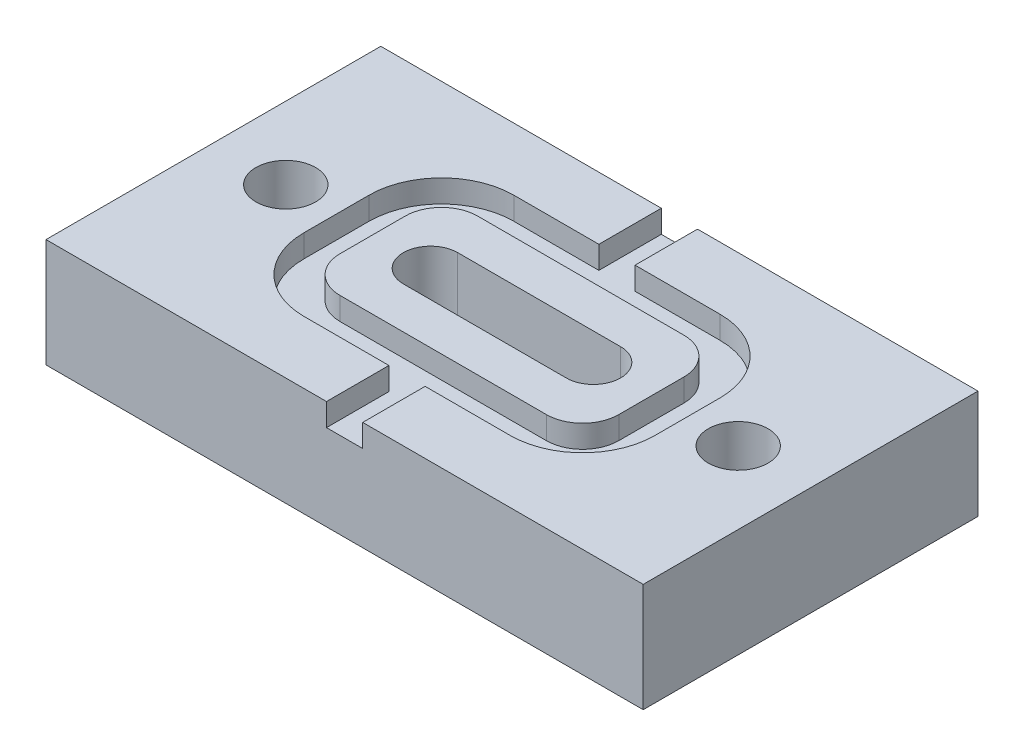
ISO-10303-21;
HEADER;
FILE_DESCRIPTION(('STEP AP214'),'2;1');
FILE_NAME('part.step','',(''),(''),'','','');
FILE_SCHEMA(('AUTOMOTIVE_DESIGN { 1 0 10303 214 1 1 1 1 }'));
ENDSEC;
DATA;
#1=APPLICATION_CONTEXT('core data for automotive mechanical design processes');
#2=APPLICATION_PROTOCOL_DEFINITION('international standard','automotive_design',2000,#1);
#3=PRODUCT_CONTEXT('',#1,'mechanical');
#4=PRODUCT('Part','Part','',(#3));
#5=PRODUCT_RELATED_PRODUCT_CATEGORY('part','',(#4));
#6=PRODUCT_DEFINITION_FORMATION('','',#4);
#7=PRODUCT_DEFINITION_CONTEXT('part definition',#1,'design');
#8=PRODUCT_DEFINITION('design','',#6,#7);
#9=PRODUCT_DEFINITION_SHAPE('','',#8);
#10=(LENGTH_UNIT() NAMED_UNIT(*) SI_UNIT(.MILLI.,.METRE.));
#11=(NAMED_UNIT(*) PLANE_ANGLE_UNIT() SI_UNIT($,.RADIAN.));
#12=(NAMED_UNIT(*) SI_UNIT($,.STERADIAN.) SOLID_ANGLE_UNIT());
#13=UNCERTAINTY_MEASURE_WITH_UNIT(LENGTH_MEASURE(1.E-05),#10,'distance_accuracy_value','');
#14=(GEOMETRIC_REPRESENTATION_CONTEXT(3) GLOBAL_UNCERTAINTY_ASSIGNED_CONTEXT((#13)) GLOBAL_UNIT_ASSIGNED_CONTEXT((#10,
#11,#12)) REPRESENTATION_CONTEXT('',''));
#15=CARTESIAN_POINT('',(0.,0.,0.));
#16=DIRECTION('',(0.,0.,1.));
#17=DIRECTION('',(1.,0.,0.));
#18=AXIS2_PLACEMENT_3D('',#15,#16,#17);
#19=CARTESIAN_POINT('',(0.,6.,0.));
#20=DIRECTION('',(0.,-1.,0.));
#21=DIRECTION('',(0.,0.,-1.));
#22=AXIS2_PLACEMENT_3D('',#19,#20,#21);
#23=PLANE('',#22);
#24=CARTESIAN_POINT('',(-12.5,6.,0.));
#25=DIRECTION('',(0.,1.,0.));
#26=DIRECTION('',(0.,0.,1.));
#27=AXIS2_PLACEMENT_3D('',#24,#25,#26);
#28=CIRCLE('',#27,1.65);
#29=CARTESIAN_POINT('',(-12.5,6.,1.65));
#30=VERTEX_POINT('',#29);
#31=EDGE_CURVE('E283',#30,#30,#28,.T.);
#32=ORIENTED_EDGE('',*,*,#31,.F.);
#33=EDGE_LOOP('',(#32));
#34=FACE_BOUND('',#33,.T.);
#35=DIRECTION('',(1.,0.,0.));
#36=VECTOR('',#35,1.);
#37=CARTESIAN_POINT('',(-16.5,6.,9.25));
#38=LINE('',#37,#36);
#39=CARTESIAN_POINT('',(-16.5,6.,9.25));
#40=VERTEX_POINT('',#39);
#41=CARTESIAN_POINT('',(-1.,6.,9.25));
#42=VERTEX_POINT('',#41);
#43=EDGE_CURVE('E489',#40,#42,#38,.T.);
#44=ORIENTED_EDGE('',*,*,#43,.T.);
#45=DIRECTION('',(0.,0.,1.));
#46=VECTOR('',#45,1.);
#47=CARTESIAN_POINT('',(-1.,6.,5.8));
#48=LINE('',#47,#46);
#49=CARTESIAN_POINT('',(-1.,6.,5.8));
#50=VERTEX_POINT('',#49);
#51=EDGE_CURVE('E430',#50,#42,#48,.T.);
#52=ORIENTED_EDGE('',*,*,#51,.F.);
#53=DIRECTION('',(1.,0.,0.));
#54=VECTOR('',#53,1.);
#55=CARTESIAN_POINT('',(-5.69999999999997,6.,5.8));
#56=LINE('',#55,#54);
#57=CARTESIAN_POINT('',(-5.69999999999997,6.,5.8));
#58=VERTEX_POINT('',#57);
#59=EDGE_CURVE('E427',#58,#50,#56,.T.);
#60=ORIENTED_EDGE('',*,*,#59,.F.);
#61=CARTESIAN_POINT('',(-5.7,6.,1.8));
#62=DIRECTION('',(0.,1.,0.));
#63=DIRECTION('',(0.,0.,-1.));
#64=AXIS2_PLACEMENT_3D('',#61,#62,#63);
#65=CIRCLE('',#64,4.);
#66=CARTESIAN_POINT('',(-9.7,6.,1.79999999999997));
#67=VERTEX_POINT('',#66);
#68=EDGE_CURVE('E424',#67,#58,#65,.T.);
#69=ORIENTED_EDGE('',*,*,#68,.F.);
#70=DIRECTION('',(0.,0.,1.));
#71=VECTOR('',#70,1.);
#72=CARTESIAN_POINT('',(-9.7,6.,1.79999999999997));
#73=LINE('',#72,#71);
#74=CARTESIAN_POINT('',(-9.7,6.,-1.79999999999997));
#75=VERTEX_POINT('',#74);
#76=EDGE_CURVE('E421',#75,#67,#73,.T.);
#77=ORIENTED_EDGE('',*,*,#76,.F.);
#78=CARTESIAN_POINT('',(-5.7,6.,-1.8));
#79=DIRECTION('',(0.,1.,0.));
#80=DIRECTION('',(0.,0.,-1.));
#81=AXIS2_PLACEMENT_3D('',#78,#79,#80);
#82=CIRCLE('',#81,4.);
#83=CARTESIAN_POINT('',(-5.69999999999997,6.,-5.8));
#84=VERTEX_POINT('',#83);
#85=EDGE_CURVE('E418',#84,#75,#82,.T.);
#86=ORIENTED_EDGE('',*,*,#85,.F.);
#87=DIRECTION('',(-1.,0.,0.));
#88=VECTOR('',#87,1.);
#89=CARTESIAN_POINT('',(-5.69999999999997,6.,-5.8));
#90=LINE('',#89,#88);
#91=CARTESIAN_POINT('',(-1.,6.,-5.8));
#92=VERTEX_POINT('',#91);
#93=EDGE_CURVE('E415',#92,#84,#90,.T.);
#94=ORIENTED_EDGE('',*,*,#93,.F.);
#95=DIRECTION('',(0.,0.,1.));
#96=VECTOR('',#95,1.);
#97=CARTESIAN_POINT('',(-1.,6.,-5.8));
#98=LINE('',#97,#96);
#99=CARTESIAN_POINT('',(-1.,6.,-9.25));
#100=VERTEX_POINT('',#99);
#101=EDGE_CURVE('E412',#100,#92,#98,.T.);
#102=ORIENTED_EDGE('',*,*,#101,.F.);
#103=DIRECTION('',(-1.,0.,0.));
#104=VECTOR('',#103,1.);
#105=CARTESIAN_POINT('',(-16.5,6.,-9.25));
#106=LINE('',#105,#104);
#107=CARTESIAN_POINT('',(-16.5,6.,-9.25));
#108=VERTEX_POINT('',#107);
#109=EDGE_CURVE('E481',#100,#108,#106,.T.);
#110=ORIENTED_EDGE('',*,*,#109,.T.);
#111=DIRECTION('',(0.,0.,1.));
#112=VECTOR('',#111,1.);
#113=CARTESIAN_POINT('',(-16.5,6.,9.25));
#114=LINE('',#113,#112);
#115=EDGE_CURVE('E486',#108,#40,#114,.T.);
#116=ORIENTED_EDGE('',*,*,#115,.T.);
#117=EDGE_LOOP('',(#44,#52,#60,#69,#77,#86,#94,#102,#110,#116));
#118=FACE_BOUND('',#117,.T.);
#119=ADVANCED_FACE('F33',(#34,#118),#23,.F.);
#120=CARTESIAN_POINT('',(16.5,6.,9.25));
#121=DIRECTION('',(-1.,0.,0.));
#122=DIRECTION('',(0.,0.,1.));
#123=AXIS2_PLACEMENT_3D('',#120,#121,#122);
#124=PLANE('',#123);
#125=DIRECTION('',(0.,0.,-1.));
#126=VECTOR('',#125,1.);
#127=CARTESIAN_POINT('',(16.5,0.,9.25));
#128=LINE('',#127,#126);
#129=CARTESIAN_POINT('',(16.5,0.,9.25));
#130=VERTEX_POINT('',#129);
#131=CARTESIAN_POINT('',(16.5,0.,-9.25));
#132=VERTEX_POINT('',#131);
#133=EDGE_CURVE('E445',#130,#132,#128,.T.);
#134=ORIENTED_EDGE('',*,*,#133,.T.);
#135=DIRECTION('',(0.,-1.,0.));
#136=VECTOR('',#135,1.);
#137=CARTESIAN_POINT('',(16.5,6.,-9.25));
#138=LINE('',#137,#136);
#139=CARTESIAN_POINT('',(16.5,6.,-9.25));
#140=VERTEX_POINT('',#139);
#141=EDGE_CURVE('E11',#140,#132,#138,.T.);
#142=ORIENTED_EDGE('',*,*,#141,.F.);
#143=DIRECTION('',(0.,0.,-1.));
#144=VECTOR('',#143,1.);
#145=CARTESIAN_POINT('',(16.5,6.,9.25));
#146=LINE('',#145,#144);
#147=CARTESIAN_POINT('',(16.5,6.,9.25));
#148=VERTEX_POINT('',#147);
#149=EDGE_CURVE('E478',#148,#140,#146,.T.);
#150=ORIENTED_EDGE('',*,*,#149,.F.);
#151=DIRECTION('',(0.,-1.,0.));
#152=VECTOR('',#151,1.);
#153=CARTESIAN_POINT('',(16.5,6.,9.25));
#154=LINE('',#153,#152);
#155=EDGE_CURVE('E492',#148,#130,#154,.T.);
#156=ORIENTED_EDGE('',*,*,#155,.T.);
#157=EDGE_LOOP('',(#134,#142,#150,#156));
#158=FACE_BOUND('',#157,.T.);
#159=ADVANCED_FACE('F35',(#158),#124,.F.);
#160=CARTESIAN_POINT('',(-16.5,6.,-9.25));
#161=DIRECTION('',(0.,0.,1.));
#162=DIRECTION('',(1.,0.,0.));
#163=AXIS2_PLACEMENT_3D('',#160,#161,#162);
#164=PLANE('',#163);
#165=ORIENTED_EDGE('',*,*,#109,.F.);
#166=DIRECTION('',(0.,1.,0.));
#167=VECTOR('',#166,1.);
#168=CARTESIAN_POINT('',(-1.,4.75,-9.25));
#169=LINE('',#168,#167);
#170=CARTESIAN_POINT('',(-1.,4.75,-9.25));
#171=VERTEX_POINT('',#170);
#172=EDGE_CURVE('E469',#171,#100,#169,.T.);
#173=ORIENTED_EDGE('',*,*,#172,.F.);
#174=DIRECTION('',(-1.,0.,0.));
#175=VECTOR('',#174,1.);
#176=CARTESIAN_POINT('',(-1.,4.75,-9.25));
#177=LINE('',#176,#175);
#178=CARTESIAN_POINT('',(0.999999999999997,4.75,-9.25));
#179=VERTEX_POINT('',#178);
#180=EDGE_CURVE('E366',#179,#171,#177,.T.);
#181=ORIENTED_EDGE('',*,*,#180,.F.);
#182=DIRECTION('',(0.,1.,0.));
#183=VECTOR('',#182,1.);
#184=CARTESIAN_POINT('',(0.999999999999997,4.75,-9.25));
#185=LINE('',#184,#183);
#186=CARTESIAN_POINT('',(0.999999999999997,6.,-9.25));
#187=VERTEX_POINT('',#186);
#188=EDGE_CURVE('E471',#179,#187,#185,.T.);
#189=ORIENTED_EDGE('',*,*,#188,.T.);
#190=EDGE_CURVE('E483',#140,#187,#106,.T.);
#191=ORIENTED_EDGE('',*,*,#190,.F.);
#192=ORIENTED_EDGE('',*,*,#141,.T.);
#193=DIRECTION('',(-1.,0.,0.));
#194=VECTOR('',#193,1.);
#195=CARTESIAN_POINT('',(-16.5,0.,-9.25));
#196=LINE('',#195,#194);
#197=CARTESIAN_POINT('',(-16.5,0.,-9.25));
#198=VERTEX_POINT('',#197);
#199=EDGE_CURVE('E495',#132,#198,#196,.T.);
#200=ORIENTED_EDGE('',*,*,#199,.T.);
#201=DIRECTION('',(0.,-1.,0.));
#202=VECTOR('',#201,1.);
#203=CARTESIAN_POINT('',(-16.5,6.,-9.25));
#204=LINE('',#203,#202);
#205=EDGE_CURVE('E41',#108,#198,#204,.T.);
#206=ORIENTED_EDGE('',*,*,#205,.F.);
#207=EDGE_LOOP('',(#165,#173,#181,#189,#191,#192,#200,#206));
#208=FACE_BOUND('',#207,.T.);
#209=ADVANCED_FACE('F546',(#208),#164,.F.);
#210=CARTESIAN_POINT('',(-16.5,6.,9.25));
#211=DIRECTION('',(1.,0.,0.));
#212=DIRECTION('',(0.,0.,-1.));
#213=AXIS2_PLACEMENT_3D('',#210,#211,#212);
#214=PLANE('',#213);
#215=DIRECTION('',(0.,0.,1.));
#216=VECTOR('',#215,1.);
#217=CARTESIAN_POINT('',(-16.5,0.,9.25));
#218=LINE('',#217,#216);
#219=CARTESIAN_POINT('',(-16.5,0.,9.25));
#220=VERTEX_POINT('',#219);
#221=EDGE_CURVE('E497',#198,#220,#218,.T.);
#222=ORIENTED_EDGE('',*,*,#221,.T.);
#223=DIRECTION('',(0.,-1.,0.));
#224=VECTOR('',#223,1.);
#225=CARTESIAN_POINT('',(-16.5,6.,9.25));
#226=LINE('',#225,#224);
#227=EDGE_CURVE('E502',#40,#220,#226,.T.);
#228=ORIENTED_EDGE('',*,*,#227,.F.);
#229=ORIENTED_EDGE('',*,*,#115,.F.);
#230=ORIENTED_EDGE('',*,*,#205,.T.);
#231=EDGE_LOOP('',(#222,#228,#229,#230));
#232=FACE_BOUND('',#231,.T.);
#233=ADVANCED_FACE('F509',(#232),#214,.F.);
#234=CARTESIAN_POINT('',(-16.5,6.,9.25));
#235=DIRECTION('',(0.,0.,-1.));
#236=DIRECTION('',(-1.,0.,0.));
#237=AXIS2_PLACEMENT_3D('',#234,#235,#236);
#238=PLANE('',#237);
#239=CARTESIAN_POINT('',(0.999999999999997,6.,9.25));
#240=VERTEX_POINT('',#239);
#241=EDGE_CURVE('E488',#240,#148,#38,.T.);
#242=ORIENTED_EDGE('',*,*,#241,.F.);
#243=DIRECTION('',(0.,1.,0.));
#244=VECTOR('',#243,1.);
#245=CARTESIAN_POINT('',(0.999999999999997,4.75,9.25));
#246=LINE('',#245,#244);
#247=CARTESIAN_POINT('',(0.999999999999997,4.75,9.25));
#248=VERTEX_POINT('',#247);
#249=EDGE_CURVE('E452',#248,#240,#246,.T.);
#250=ORIENTED_EDGE('',*,*,#249,.F.);
#251=DIRECTION('',(1.,0.,0.));
#252=VECTOR('',#251,1.);
#253=CARTESIAN_POINT('',(-1.,4.75,9.25));
#254=LINE('',#253,#252);
#255=CARTESIAN_POINT('',(-1.,4.75,9.25));
#256=VERTEX_POINT('',#255);
#257=EDGE_CURVE('E390',#256,#248,#254,.T.);
#258=ORIENTED_EDGE('',*,*,#257,.F.);
#259=DIRECTION('',(0.,1.,0.));
#260=VECTOR('',#259,1.);
#261=CARTESIAN_POINT('',(-1.,4.75,9.25));
#262=LINE('',#261,#260);
#263=EDGE_CURVE('E454',#256,#42,#262,.T.);
#264=ORIENTED_EDGE('',*,*,#263,.T.);
#265=ORIENTED_EDGE('',*,*,#43,.F.);
#266=ORIENTED_EDGE('',*,*,#227,.T.);
#267=DIRECTION('',(1.,0.,0.));
#268=VECTOR('',#267,1.);
#269=CARTESIAN_POINT('',(-16.5,0.,9.25));
#270=LINE('',#269,#268);
#271=EDGE_CURVE('E482',#220,#130,#270,.T.);
#272=ORIENTED_EDGE('',*,*,#271,.T.);
#273=ORIENTED_EDGE('',*,*,#155,.F.);
#274=EDGE_LOOP('',(#242,#250,#258,#264,#265,#266,#272,#273));
#275=FACE_BOUND('',#274,.T.);
#276=ADVANCED_FACE('F519',(#275),#238,.F.);
#277=CARTESIAN_POINT('',(12.5,6.,0.));
#278=DIRECTION('',(0.,1.,0.));
#279=DIRECTION('',(0.,0.,1.));
#280=AXIS2_PLACEMENT_3D('',#277,#278,#279);
#281=CIRCLE('',#280,1.65);
#282=CARTESIAN_POINT('',(12.5,6.,1.65));
#283=VERTEX_POINT('',#282);
#284=EDGE_CURVE('E275',#283,#283,#281,.T.);
#285=ORIENTED_EDGE('',*,*,#284,.F.);
#286=EDGE_LOOP('',(#285));
#287=FACE_BOUND('',#286,.T.);
#288=DIRECTION('',(1.,0.,0.));
#289=VECTOR('',#288,1.);
#290=CARTESIAN_POINT('',(5.69999999999997,6.,5.8));
#291=LINE('',#290,#289);
#292=CARTESIAN_POINT('',(0.999999999999997,6.,5.8));
#293=VERTEX_POINT('',#292);
#294=CARTESIAN_POINT('',(5.69999999999997,6.,5.8));
#295=VERTEX_POINT('',#294);
#296=EDGE_CURVE('E435',#293,#295,#291,.T.);
#297=ORIENTED_EDGE('',*,*,#296,.F.);
#298=DIRECTION('',(0.,0.,-1.));
#299=VECTOR('',#298,1.);
#300=CARTESIAN_POINT('',(0.999999999999997,6.,5.8));
#301=LINE('',#300,#299);
#302=EDGE_CURVE('E432',#240,#293,#301,.T.);
#303=ORIENTED_EDGE('',*,*,#302,.F.);
#304=ORIENTED_EDGE('',*,*,#241,.T.);
#305=ORIENTED_EDGE('',*,*,#149,.T.);
#306=ORIENTED_EDGE('',*,*,#190,.T.);
#307=DIRECTION('',(0.,0.,-1.));
#308=VECTOR('',#307,1.);
#309=CARTESIAN_POINT('',(0.999999999999997,6.,-5.8));
#310=LINE('',#309,#308);
#311=CARTESIAN_POINT('',(0.999999999999997,6.,-5.8));
#312=VERTEX_POINT('',#311);
#313=EDGE_CURVE('E410',#312,#187,#310,.T.);
#314=ORIENTED_EDGE('',*,*,#313,.F.);
#315=DIRECTION('',(-1.,0.,0.));
#316=VECTOR('',#315,1.);
#317=CARTESIAN_POINT('',(5.69999999999997,6.,-5.8));
#318=LINE('',#317,#316);
#319=CARTESIAN_POINT('',(5.69999999999997,6.,-5.8));
#320=VERTEX_POINT('',#319);
#321=EDGE_CURVE('E407',#320,#312,#318,.T.);
#322=ORIENTED_EDGE('',*,*,#321,.F.);
#323=CARTESIAN_POINT('',(5.7,6.,-1.8));
#324=DIRECTION('',(0.,1.,0.));
#325=DIRECTION('',(0.,0.,-1.));
#326=AXIS2_PLACEMENT_3D('',#323,#324,#325);
#327=CIRCLE('',#326,4.);
#328=CARTESIAN_POINT('',(9.7,6.,-1.79999999999997));
#329=VERTEX_POINT('',#328);
#330=EDGE_CURVE('E341',#329,#320,#327,.T.);
#331=ORIENTED_EDGE('',*,*,#330,.F.);
#332=DIRECTION('',(0.,0.,-1.));
#333=VECTOR('',#332,1.);
#334=CARTESIAN_POINT('',(9.7,6.,1.79999999999997));
#335=LINE('',#334,#333);
#336=CARTESIAN_POINT('',(9.7,6.,1.79999999999997));
#337=VERTEX_POINT('',#336);
#338=EDGE_CURVE('E360',#337,#329,#335,.T.);
#339=ORIENTED_EDGE('',*,*,#338,.F.);
#340=CARTESIAN_POINT('',(5.69999999999999,6.,1.8));
#341=DIRECTION('',(0.,1.,0.));
#342=DIRECTION('',(0.,0.,1.));
#343=AXIS2_PLACEMENT_3D('',#340,#341,#342);
#344=CIRCLE('',#343,4.);
#345=EDGE_CURVE('E438',#295,#337,#344,.T.);
#346=ORIENTED_EDGE('',*,*,#345,.F.);
#347=EDGE_LOOP('',(#297,#303,#304,#305,#306,#314,#322,#331,#339,#346));
#348=FACE_BOUND('',#347,.T.);
#349=ADVANCED_FACE('F526',(#287,#348),#23,.F.);
#350=CARTESIAN_POINT('',(0.,0.,0.));
#351=DIRECTION('',(0.,-1.,0.));
#352=DIRECTION('',(0.,0.,-1.));
#353=AXIS2_PLACEMENT_3D('',#350,#351,#352);
#354=PLANE('',#353);
#355=CARTESIAN_POINT('',(4.5,0.,0.));
#356=DIRECTION('',(0.,1.,0.));
#357=DIRECTION('',(0.,0.,1.));
#358=AXIS2_PLACEMENT_3D('',#355,#356,#357);
#359=CIRCLE('',#358,1.5);
#360=CARTESIAN_POINT('',(4.5,0.,1.5));
#361=VERTEX_POINT('',#360);
#362=CARTESIAN_POINT('',(4.5,0.,-1.5));
#363=VERTEX_POINT('',#362);
#364=EDGE_CURVE('E244',#361,#363,#359,.T.);
#365=ORIENTED_EDGE('',*,*,#364,.T.);
#366=DIRECTION('',(-1.,0.,0.));
#367=VECTOR('',#366,1.);
#368=CARTESIAN_POINT('',(-4.5,0.,-1.5));
#369=LINE('',#368,#367);
#370=CARTESIAN_POINT('',(-4.5,0.,-1.5));
#371=VERTEX_POINT('',#370);
#372=EDGE_CURVE('E253',#363,#371,#369,.T.);
#373=ORIENTED_EDGE('',*,*,#372,.T.);
#374=CARTESIAN_POINT('',(-4.5,0.,0.));
#375=DIRECTION('',(0.,1.,0.));
#376=DIRECTION('',(0.,0.,1.));
#377=AXIS2_PLACEMENT_3D('',#374,#375,#376);
#378=CIRCLE('',#377,1.5);
#379=CARTESIAN_POINT('',(-4.5,0.,1.5));
#380=VERTEX_POINT('',#379);
#381=EDGE_CURVE('E48',#371,#380,#378,.T.);
#382=ORIENTED_EDGE('',*,*,#381,.T.);
#383=DIRECTION('',(1.,0.,0.));
#384=VECTOR('',#383,1.);
#385=CARTESIAN_POINT('',(-4.5,0.,1.5));
#386=LINE('',#385,#384);
#387=EDGE_CURVE('E250',#380,#361,#386,.T.);
#388=ORIENTED_EDGE('',*,*,#387,.T.);
#389=EDGE_LOOP('',(#365,#373,#382,#388));
#390=FACE_BOUND('',#389,.T.);
#391=CARTESIAN_POINT('',(-12.5,0.,0.));
#392=DIRECTION('',(0.,1.,0.));
#393=DIRECTION('',(0.,0.,1.));
#394=AXIS2_PLACEMENT_3D('',#391,#392,#393);
#395=CIRCLE('',#394,1.65);
#396=CARTESIAN_POINT('',(-12.5,0.,1.65));
#397=VERTEX_POINT('',#396);
#398=EDGE_CURVE('E279',#397,#397,#395,.T.);
#399=ORIENTED_EDGE('',*,*,#398,.T.);
#400=EDGE_LOOP('',(#399));
#401=FACE_BOUND('',#400,.T.);
#402=CARTESIAN_POINT('',(12.5,0.,0.));
#403=DIRECTION('',(0.,1.,0.));
#404=DIRECTION('',(0.,0.,1.));
#405=AXIS2_PLACEMENT_3D('',#402,#403,#404);
#406=CIRCLE('',#405,1.65);
#407=CARTESIAN_POINT('',(12.5,0.,1.65));
#408=VERTEX_POINT('',#407);
#409=EDGE_CURVE('E286',#408,#408,#406,.T.);
#410=ORIENTED_EDGE('',*,*,#409,.T.);
#411=EDGE_LOOP('',(#410));
#412=FACE_BOUND('',#411,.T.);
#413=ORIENTED_EDGE('',*,*,#133,.F.);
#414=ORIENTED_EDGE('',*,*,#271,.F.);
#415=ORIENTED_EDGE('',*,*,#221,.F.);
#416=ORIENTED_EDGE('',*,*,#199,.F.);
#417=EDGE_LOOP('',(#413,#414,#415,#416));
#418=FACE_BOUND('',#417,.T.);
#419=ADVANCED_FACE('F257',(#390,#401,#412,#418),#354,.T.);
#420=CARTESIAN_POINT('',(5.7,4.75,-1.8));
#421=DIRECTION('',(0.,1.,0.));
#422=DIRECTION('',(0.,0.,1.));
#423=AXIS2_PLACEMENT_3D('',#420,#421,#422);
#424=CYLINDRICAL_SURFACE('',#423,4.);
#425=ORIENTED_EDGE('',*,*,#330,.T.);
#426=DIRECTION('',(0.,1.,0.));
#427=VECTOR('',#426,1.);
#428=CARTESIAN_POINT('',(5.69999999999997,4.75,-5.8));
#429=LINE('',#428,#427);
#430=CARTESIAN_POINT('',(5.69999999999997,4.75,-5.8));
#431=VERTEX_POINT('',#430);
#432=EDGE_CURVE('E405',#431,#320,#429,.T.);
#433=ORIENTED_EDGE('',*,*,#432,.F.);
#434=CARTESIAN_POINT('',(5.7,4.75,-1.8));
#435=DIRECTION('',(0.,1.,0.));
#436=DIRECTION('',(0.,0.,-1.));
#437=AXIS2_PLACEMENT_3D('',#434,#435,#436);
#438=CIRCLE('',#437,4.);
#439=CARTESIAN_POINT('',(9.7,4.75,-1.79999999999997));
#440=VERTEX_POINT('',#439);
#441=EDGE_CURVE('E356',#440,#431,#438,.T.);
#442=ORIENTED_EDGE('',*,*,#441,.F.);
#443=DIRECTION('',(0.,1.,0.));
#444=VECTOR('',#443,1.);
#445=CARTESIAN_POINT('',(9.7,4.75,-1.79999999999997));
#446=LINE('',#445,#444);
#447=EDGE_CURVE('E443',#440,#329,#446,.T.);
#448=ORIENTED_EDGE('',*,*,#447,.T.);
#449=EDGE_LOOP('',(#425,#433,#442,#448));
#450=FACE_BOUND('',#449,.T.);
#451=ADVANCED_FACE('F562',(#450),#424,.F.);
#452=CARTESIAN_POINT('',(9.7,4.75,1.79999999999997));
#453=DIRECTION('',(1.,0.,0.));
#454=DIRECTION('',(0.,0.,-1.));
#455=AXIS2_PLACEMENT_3D('',#452,#453,#454);
#456=PLANE('',#455);
#457=ORIENTED_EDGE('',*,*,#338,.T.);
#458=ORIENTED_EDGE('',*,*,#447,.F.);
#459=DIRECTION('',(0.,0.,-1.));
#460=VECTOR('',#459,1.);
#461=CARTESIAN_POINT('',(9.7,4.75,1.79999999999997));
#462=LINE('',#461,#460);
#463=CARTESIAN_POINT('',(9.7,4.75,1.79999999999997));
#464=VERTEX_POINT('',#463);
#465=EDGE_CURVE('E402',#464,#440,#462,.T.);
#466=ORIENTED_EDGE('',*,*,#465,.F.);
#467=DIRECTION('',(0.,1.,0.));
#468=VECTOR('',#467,1.);
#469=CARTESIAN_POINT('',(9.7,4.75,1.79999999999997));
#470=LINE('',#469,#468);
#471=EDGE_CURVE('E446',#464,#337,#470,.T.);
#472=ORIENTED_EDGE('',*,*,#471,.T.);
#473=EDGE_LOOP('',(#457,#458,#466,#472));
#474=FACE_BOUND('',#473,.T.);
#475=ADVANCED_FACE('F565',(#474),#456,.F.);
#476=CARTESIAN_POINT('',(5.69999999999999,4.75,1.8));
#477=DIRECTION('',(0.,1.,0.));
#478=DIRECTION('',(0.,0.,1.));
#479=AXIS2_PLACEMENT_3D('',#476,#477,#478);
#480=CYLINDRICAL_SURFACE('',#479,4.);
#481=ORIENTED_EDGE('',*,*,#345,.T.);
#482=ORIENTED_EDGE('',*,*,#471,.F.);
#483=CARTESIAN_POINT('',(5.69999999999999,4.75,1.8));
#484=DIRECTION('',(0.,1.,0.));
#485=DIRECTION('',(0.,0.,1.));
#486=AXIS2_PLACEMENT_3D('',#483,#484,#485);
#487=CIRCLE('',#486,4.);
#488=CARTESIAN_POINT('',(5.69999999999997,4.75,5.8));
#489=VERTEX_POINT('',#488);
#490=EDGE_CURVE('E399',#489,#464,#487,.T.);
#491=ORIENTED_EDGE('',*,*,#490,.F.);
#492=DIRECTION('',(0.,1.,0.));
#493=VECTOR('',#492,1.);
#494=CARTESIAN_POINT('',(5.69999999999997,4.75,5.8));
#495=LINE('',#494,#493);
#496=EDGE_CURVE('E448',#489,#295,#495,.T.);
#497=ORIENTED_EDGE('',*,*,#496,.T.);
#498=EDGE_LOOP('',(#481,#482,#491,#497));
#499=FACE_BOUND('',#498,.T.);
#500=ADVANCED_FACE('F568',(#499),#480,.F.);
#501=CARTESIAN_POINT('',(5.69999999999997,4.75,5.8));
#502=DIRECTION('',(0.,0.,1.));
#503=DIRECTION('',(1.,0.,0.));
#504=AXIS2_PLACEMENT_3D('',#501,#502,#503);
#505=PLANE('',#504);
#506=ORIENTED_EDGE('',*,*,#296,.T.);
#507=ORIENTED_EDGE('',*,*,#496,.F.);
#508=DIRECTION('',(1.,0.,0.));
#509=VECTOR('',#508,1.);
#510=CARTESIAN_POINT('',(5.69999999999997,4.75,5.8));
#511=LINE('',#510,#509);
#512=CARTESIAN_POINT('',(0.999999999999997,4.75,5.8));
#513=VERTEX_POINT('',#512);
#514=EDGE_CURVE('E396',#513,#489,#511,.T.);
#515=ORIENTED_EDGE('',*,*,#514,.F.);
#516=DIRECTION('',(0.,1.,0.));
#517=VECTOR('',#516,1.);
#518=CARTESIAN_POINT('',(0.999999999999997,4.75,5.8));
#519=LINE('',#518,#517);
#520=EDGE_CURVE('E450',#513,#293,#519,.T.);
#521=ORIENTED_EDGE('',*,*,#520,.T.);
#522=EDGE_LOOP('',(#506,#507,#515,#521));
#523=FACE_BOUND('',#522,.T.);
#524=ADVANCED_FACE('F571',(#523),#505,.F.);
#525=CARTESIAN_POINT('',(0.999999999999997,4.75,5.8));
#526=DIRECTION('',(1.,0.,0.));
#527=DIRECTION('',(0.,0.,-1.));
#528=AXIS2_PLACEMENT_3D('',#525,#526,#527);
#529=PLANE('',#528);
#530=ORIENTED_EDGE('',*,*,#302,.T.);
#531=ORIENTED_EDGE('',*,*,#520,.F.);
#532=DIRECTION('',(0.,0.,-1.));
#533=VECTOR('',#532,1.);
#534=CARTESIAN_POINT('',(0.999999999999997,4.75,5.8));
#535=LINE('',#534,#533);
#536=EDGE_CURVE('E393',#248,#513,#535,.T.);
#537=ORIENTED_EDGE('',*,*,#536,.F.);
#538=ORIENTED_EDGE('',*,*,#249,.T.);
#539=EDGE_LOOP('',(#530,#531,#537,#538));
#540=FACE_BOUND('',#539,.T.);
#541=ADVANCED_FACE('F532',(#540),#529,.F.);
#542=CARTESIAN_POINT('',(-1.,4.75,5.8));
#543=DIRECTION('',(-1.,0.,0.));
#544=DIRECTION('',(0.,0.,1.));
#545=AXIS2_PLACEMENT_3D('',#542,#543,#544);
#546=PLANE('',#545);
#547=ORIENTED_EDGE('',*,*,#51,.T.);
#548=ORIENTED_EDGE('',*,*,#263,.F.);
#549=DIRECTION('',(0.,0.,1.));
#550=VECTOR('',#549,1.);
#551=CARTESIAN_POINT('',(-1.,4.75,5.8));
#552=LINE('',#551,#550);
#553=CARTESIAN_POINT('',(-1.,4.75,5.8));
#554=VERTEX_POINT('',#553);
#555=EDGE_CURVE('E387',#554,#256,#552,.T.);
#556=ORIENTED_EDGE('',*,*,#555,.F.);
#557=DIRECTION('',(0.,1.,0.));
#558=VECTOR('',#557,1.);
#559=CARTESIAN_POINT('',(-1.,4.75,5.8));
#560=LINE('',#559,#558);
#561=EDGE_CURVE('E457',#554,#50,#560,.T.);
#562=ORIENTED_EDGE('',*,*,#561,.T.);
#563=EDGE_LOOP('',(#547,#548,#556,#562));
#564=FACE_BOUND('',#563,.T.);
#565=ADVANCED_FACE('F539',(#564),#546,.F.);
#566=CARTESIAN_POINT('',(-5.69999999999997,4.75,5.8));
#567=DIRECTION('',(0.,0.,1.));
#568=DIRECTION('',(1.,0.,0.));
#569=AXIS2_PLACEMENT_3D('',#566,#567,#568);
#570=PLANE('',#569);
#571=ORIENTED_EDGE('',*,*,#59,.T.);
#572=ORIENTED_EDGE('',*,*,#561,.F.);
#573=DIRECTION('',(1.,0.,0.));
#574=VECTOR('',#573,1.);
#575=CARTESIAN_POINT('',(-5.69999999999997,4.75,5.8));
#576=LINE('',#575,#574);
#577=CARTESIAN_POINT('',(-5.69999999999997,4.75,5.8));
#578=VERTEX_POINT('',#577);
#579=EDGE_CURVE('E384',#578,#554,#576,.T.);
#580=ORIENTED_EDGE('',*,*,#579,.F.);
#581=DIRECTION('',(0.,1.,0.));
#582=VECTOR('',#581,1.);
#583=CARTESIAN_POINT('',(-5.69999999999997,4.75,5.8));
#584=LINE('',#583,#582);
#585=EDGE_CURVE('E459',#578,#58,#584,.T.);
#586=ORIENTED_EDGE('',*,*,#585,.T.);
#587=EDGE_LOOP('',(#571,#572,#580,#586));
#588=FACE_BOUND('',#587,.T.);
#589=ADVANCED_FACE('F677',(#588),#570,.F.);
#590=CARTESIAN_POINT('',(-5.7,4.75,1.8));
#591=DIRECTION('',(0.,1.,0.));
#592=DIRECTION('',(0.,0.,1.));
#593=AXIS2_PLACEMENT_3D('',#590,#591,#592);
#594=CYLINDRICAL_SURFACE('',#593,4.);
#595=ORIENTED_EDGE('',*,*,#68,.T.);
#596=ORIENTED_EDGE('',*,*,#585,.F.);
#597=CARTESIAN_POINT('',(-5.7,4.75,1.8));
#598=DIRECTION('',(0.,1.,0.));
#599=DIRECTION('',(0.,0.,-1.));
#600=AXIS2_PLACEMENT_3D('',#597,#598,#599);
#601=CIRCLE('',#600,4.);
#602=CARTESIAN_POINT('',(-9.7,4.75,1.79999999999997));
#603=VERTEX_POINT('',#602);
#604=EDGE_CURVE('E381',#603,#578,#601,.T.);
#605=ORIENTED_EDGE('',*,*,#604,.F.);
#606=DIRECTION('',(0.,1.,0.));
#607=VECTOR('',#606,1.);
#608=CARTESIAN_POINT('',(-9.7,4.75,1.79999999999997));
#609=LINE('',#608,#607);
#610=EDGE_CURVE('E461',#603,#67,#609,.T.);
#611=ORIENTED_EDGE('',*,*,#610,.T.);
#612=EDGE_LOOP('',(#595,#596,#605,#611));
#613=FACE_BOUND('',#612,.T.);
#614=ADVANCED_FACE('F673',(#613),#594,.F.);
#615=CARTESIAN_POINT('',(-9.7,4.75,1.79999999999997));
#616=DIRECTION('',(-1.,0.,0.));
#617=DIRECTION('',(0.,0.,1.));
#618=AXIS2_PLACEMENT_3D('',#615,#616,#617);
#619=PLANE('',#618);
#620=ORIENTED_EDGE('',*,*,#76,.T.);
#621=ORIENTED_EDGE('',*,*,#610,.F.);
#622=DIRECTION('',(0.,0.,1.));
#623=VECTOR('',#622,1.);
#624=CARTESIAN_POINT('',(-9.7,4.75,1.79999999999997));
#625=LINE('',#624,#623);
#626=CARTESIAN_POINT('',(-9.7,4.75,-1.79999999999997));
#627=VERTEX_POINT('',#626);
#628=EDGE_CURVE('E378',#627,#603,#625,.T.);
#629=ORIENTED_EDGE('',*,*,#628,.F.);
#630=DIRECTION('',(0.,1.,0.));
#631=VECTOR('',#630,1.);
#632=CARTESIAN_POINT('',(-9.7,4.75,-1.79999999999997));
#633=LINE('',#632,#631);
#634=EDGE_CURVE('E463',#627,#75,#633,.T.);
#635=ORIENTED_EDGE('',*,*,#634,.T.);
#636=EDGE_LOOP('',(#620,#621,#629,#635));
#637=FACE_BOUND('',#636,.T.);
#638=ADVANCED_FACE('F669',(#637),#619,.F.);
#639=CARTESIAN_POINT('',(-5.7,4.75,-1.8));
#640=DIRECTION('',(0.,1.,0.));
#641=DIRECTION('',(0.,0.,1.));
#642=AXIS2_PLACEMENT_3D('',#639,#640,#641);
#643=CYLINDRICAL_SURFACE('',#642,4.);
#644=ORIENTED_EDGE('',*,*,#85,.T.);
#645=ORIENTED_EDGE('',*,*,#634,.F.);
#646=CARTESIAN_POINT('',(-5.7,4.75,-1.8));
#647=DIRECTION('',(0.,1.,0.));
#648=DIRECTION('',(0.,0.,-1.));
#649=AXIS2_PLACEMENT_3D('',#646,#647,#648);
#650=CIRCLE('',#649,4.);
#651=CARTESIAN_POINT('',(-5.69999999999997,4.75,-5.8));
#652=VERTEX_POINT('',#651);
#653=EDGE_CURVE('E375',#652,#627,#650,.T.);
#654=ORIENTED_EDGE('',*,*,#653,.F.);
#655=DIRECTION('',(0.,1.,0.));
#656=VECTOR('',#655,1.);
#657=CARTESIAN_POINT('',(-5.69999999999997,4.75,-5.8));
#658=LINE('',#657,#656);
#659=EDGE_CURVE('E465',#652,#84,#658,.T.);
#660=ORIENTED_EDGE('',*,*,#659,.T.);
#661=EDGE_LOOP('',(#644,#645,#654,#660));
#662=FACE_BOUND('',#661,.T.);
#663=ADVANCED_FACE('F665',(#662),#643,.F.);
#664=CARTESIAN_POINT('',(-5.69999999999997,4.75,-5.8));
#665=DIRECTION('',(0.,0.,-1.));
#666=DIRECTION('',(-1.,0.,0.));
#667=AXIS2_PLACEMENT_3D('',#664,#665,#666);
#668=PLANE('',#667);
#669=ORIENTED_EDGE('',*,*,#93,.T.);
#670=ORIENTED_EDGE('',*,*,#659,.F.);
#671=DIRECTION('',(-1.,0.,0.));
#672=VECTOR('',#671,1.);
#673=CARTESIAN_POINT('',(-5.69999999999997,4.75,-5.8));
#674=LINE('',#673,#672);
#675=CARTESIAN_POINT('',(-1.,4.75,-5.8));
#676=VERTEX_POINT('',#675);
#677=EDGE_CURVE('E372',#676,#652,#674,.T.);
#678=ORIENTED_EDGE('',*,*,#677,.F.);
#679=DIRECTION('',(0.,1.,0.));
#680=VECTOR('',#679,1.);
#681=CARTESIAN_POINT('',(-1.,4.75,-5.8));
#682=LINE('',#681,#680);
#683=EDGE_CURVE('E467',#676,#92,#682,.T.);
#684=ORIENTED_EDGE('',*,*,#683,.T.);
#685=EDGE_LOOP('',(#669,#670,#678,#684));
#686=FACE_BOUND('',#685,.T.);
#687=ADVANCED_FACE('F662',(#686),#668,.F.);
#688=CARTESIAN_POINT('',(-1.,4.75,-5.8));
#689=DIRECTION('',(-1.,0.,0.));
#690=DIRECTION('',(0.,0.,1.));
#691=AXIS2_PLACEMENT_3D('',#688,#689,#690);
#692=PLANE('',#691);
#693=ORIENTED_EDGE('',*,*,#101,.T.);
#694=ORIENTED_EDGE('',*,*,#683,.F.);
#695=DIRECTION('',(0.,0.,1.));
#696=VECTOR('',#695,1.);
#697=CARTESIAN_POINT('',(-1.,4.75,-5.8));
#698=LINE('',#697,#696);
#699=EDGE_CURVE('E369',#171,#676,#698,.T.);
#700=ORIENTED_EDGE('',*,*,#699,.F.);
#701=ORIENTED_EDGE('',*,*,#172,.T.);
#702=EDGE_LOOP('',(#693,#694,#700,#701));
#703=FACE_BOUND('',#702,.T.);
#704=ADVANCED_FACE('F549',(#703),#692,.F.);
#705=CARTESIAN_POINT('',(0.999999999999997,4.75,-5.8));
#706=DIRECTION('',(1.,0.,0.));
#707=DIRECTION('',(0.,0.,-1.));
#708=AXIS2_PLACEMENT_3D('',#705,#706,#707);
#709=PLANE('',#708);
#710=ORIENTED_EDGE('',*,*,#313,.T.);
#711=ORIENTED_EDGE('',*,*,#188,.F.);
#712=DIRECTION('',(0.,0.,-1.));
#713=VECTOR('',#712,1.);
#714=CARTESIAN_POINT('',(0.999999999999997,4.75,-5.8));
#715=LINE('',#714,#713);
#716=CARTESIAN_POINT('',(0.999999999999997,4.75,-5.8));
#717=VERTEX_POINT('',#716);
#718=EDGE_CURVE('E363',#717,#179,#715,.T.);
#719=ORIENTED_EDGE('',*,*,#718,.F.);
#720=DIRECTION('',(0.,1.,0.));
#721=VECTOR('',#720,1.);
#722=CARTESIAN_POINT('',(0.999999999999997,4.75,-5.8));
#723=LINE('',#722,#721);
#724=EDGE_CURVE('E474',#717,#312,#723,.T.);
#725=ORIENTED_EDGE('',*,*,#724,.T.);
#726=EDGE_LOOP('',(#710,#711,#719,#725));
#727=FACE_BOUND('',#726,.T.);
#728=ADVANCED_FACE('F554',(#727),#709,.F.);
#729=CARTESIAN_POINT('',(5.69999999999997,4.75,-5.8));
#730=DIRECTION('',(0.,0.,-1.));
#731=DIRECTION('',(-1.,0.,0.));
#732=AXIS2_PLACEMENT_3D('',#729,#730,#731);
#733=PLANE('',#732);
#734=ORIENTED_EDGE('',*,*,#321,.T.);
#735=ORIENTED_EDGE('',*,*,#724,.F.);
#736=DIRECTION('',(-1.,0.,0.));
#737=VECTOR('',#736,1.);
#738=CARTESIAN_POINT('',(5.69999999999997,4.75,-5.8));
#739=LINE('',#738,#737);
#740=EDGE_CURVE('E359',#431,#717,#739,.T.);
#741=ORIENTED_EDGE('',*,*,#740,.F.);
#742=ORIENTED_EDGE('',*,*,#432,.T.);
#743=EDGE_LOOP('',(#734,#735,#741,#742));
#744=FACE_BOUND('',#743,.T.);
#745=ADVANCED_FACE('F559',(#744),#733,.F.);
#746=CARTESIAN_POINT('',(5.7,4.75,-1.8));
#747=DIRECTION('',(0.,-1.,0.));
#748=DIRECTION('',(0.,0.,-1.));
#749=AXIS2_PLACEMENT_3D('',#746,#747,#748);
#750=PLANE('',#749);
#751=CARTESIAN_POINT('',(5.7,4.75,-1.8));
#752=DIRECTION('',(0.,1.,0.));
#753=DIRECTION('',(0.,0.,-1.));
#754=AXIS2_PLACEMENT_3D('',#751,#752,#753);
#755=CIRCLE('',#754,2.);
#756=CARTESIAN_POINT('',(7.7,4.75,-1.79999999999999));
#757=VERTEX_POINT('',#756);
#758=CARTESIAN_POINT('',(5.69999999999998,4.75,-3.8));
#759=VERTEX_POINT('',#758);
#760=EDGE_CURVE('E291',#757,#759,#755,.T.);
#761=ORIENTED_EDGE('',*,*,#760,.F.);
#762=DIRECTION('',(0.,0.,-1.));
#763=VECTOR('',#762,1.);
#764=CARTESIAN_POINT('',(7.7,4.75,1.79999999999999));
#765=LINE('',#764,#763);
#766=CARTESIAN_POINT('',(7.7,4.75,1.79999999999999));
#767=VERTEX_POINT('',#766);
#768=EDGE_CURVE('E313',#767,#757,#765,.T.);
#769=ORIENTED_EDGE('',*,*,#768,.F.);
#770=CARTESIAN_POINT('',(5.7,4.75,1.8));
#771=DIRECTION('',(0.,1.,0.));
#772=DIRECTION('',(0.,0.,1.));
#773=AXIS2_PLACEMENT_3D('',#770,#771,#772);
#774=CIRCLE('',#773,2.);
#775=CARTESIAN_POINT('',(5.69999999999998,4.75,3.8));
#776=VERTEX_POINT('',#775);
#777=EDGE_CURVE('E310',#776,#767,#774,.T.);
#778=ORIENTED_EDGE('',*,*,#777,.F.);
#779=DIRECTION('',(1.,0.,0.));
#780=VECTOR('',#779,1.);
#781=CARTESIAN_POINT('',(-5.69999999999999,4.75,3.8));
#782=LINE('',#781,#780);
#783=CARTESIAN_POINT('',(-5.69999999999999,4.75,3.8));
#784=VERTEX_POINT('',#783);
#785=EDGE_CURVE('E307',#784,#776,#782,.T.);
#786=ORIENTED_EDGE('',*,*,#785,.F.);
#787=CARTESIAN_POINT('',(-5.7,4.75,1.8));
#788=DIRECTION('',(0.,1.,0.));
#789=DIRECTION('',(0.,0.,-1.));
#790=AXIS2_PLACEMENT_3D('',#787,#788,#789);
#791=CIRCLE('',#790,2.);
#792=CARTESIAN_POINT('',(-7.7,4.75,1.79999999999999));
#793=VERTEX_POINT('',#792);
#794=EDGE_CURVE('E304',#793,#784,#791,.T.);
#795=ORIENTED_EDGE('',*,*,#794,.F.);
#796=DIRECTION('',(0.,0.,1.));
#797=VECTOR('',#796,1.);
#798=CARTESIAN_POINT('',(-7.7,4.75,1.79999999999999));
#799=LINE('',#798,#797);
#800=CARTESIAN_POINT('',(-7.7,4.75,-1.79999999999999));
#801=VERTEX_POINT('',#800);
#802=EDGE_CURVE('E301',#801,#793,#799,.T.);
#803=ORIENTED_EDGE('',*,*,#802,.F.);
#804=CARTESIAN_POINT('',(-5.7,4.75,-1.8));
#805=DIRECTION('',(0.,1.,0.));
#806=DIRECTION('',(0.,0.,-1.));
#807=AXIS2_PLACEMENT_3D('',#804,#805,#806);
#808=CIRCLE('',#807,2.);
#809=CARTESIAN_POINT('',(-5.69999999999999,4.75,-3.8));
#810=VERTEX_POINT('',#809);
#811=EDGE_CURVE('E298',#810,#801,#808,.T.);
#812=ORIENTED_EDGE('',*,*,#811,.F.);
#813=DIRECTION('',(-1.,0.,0.));
#814=VECTOR('',#813,1.);
#815=CARTESIAN_POINT('',(-5.69999999999999,4.75,-3.8));
#816=LINE('',#815,#814);
#817=EDGE_CURVE('E294',#759,#810,#816,.T.);
#818=ORIENTED_EDGE('',*,*,#817,.F.);
#819=EDGE_LOOP('',(#761,#769,#778,#786,#795,#803,#812,#818));
#820=FACE_BOUND('',#819,.T.);
#821=ORIENTED_EDGE('',*,*,#441,.T.);
#822=ORIENTED_EDGE('',*,*,#740,.T.);
#823=ORIENTED_EDGE('',*,*,#718,.T.);
#824=ORIENTED_EDGE('',*,*,#180,.T.);
#825=ORIENTED_EDGE('',*,*,#699,.T.);
#826=ORIENTED_EDGE('',*,*,#677,.T.);
#827=ORIENTED_EDGE('',*,*,#653,.T.);
#828=ORIENTED_EDGE('',*,*,#628,.T.);
#829=ORIENTED_EDGE('',*,*,#604,.T.);
#830=ORIENTED_EDGE('',*,*,#579,.T.);
#831=ORIENTED_EDGE('',*,*,#555,.T.);
#832=ORIENTED_EDGE('',*,*,#257,.T.);
#833=ORIENTED_EDGE('',*,*,#536,.T.);
#834=ORIENTED_EDGE('',*,*,#514,.T.);
#835=ORIENTED_EDGE('',*,*,#490,.T.);
#836=ORIENTED_EDGE('',*,*,#465,.T.);
#837=EDGE_LOOP('',(#821,#822,#823,#824,#825,#826,#827,#828,#829,#830,#831,#832,#833,#834,#835,#836));
#838=FACE_BOUND('',#837,.T.);
#839=ADVANCED_FACE('F535',(#820,#838),#750,.F.);
#840=CARTESIAN_POINT('',(5.7,4.75,-1.8));
#841=DIRECTION('',(0.,1.,0.));
#842=DIRECTION('',(0.,0.,1.));
#843=AXIS2_PLACEMENT_3D('',#840,#841,#842);
#844=CYLINDRICAL_SURFACE('',#843,2.);
#845=CARTESIAN_POINT('',(5.7,6.,-1.8));
#846=DIRECTION('',(0.,1.,0.));
#847=DIRECTION('',(0.,0.,-1.));
#848=AXIS2_PLACEMENT_3D('',#845,#846,#847);
#849=CIRCLE('',#848,2.);
#850=CARTESIAN_POINT('',(7.7,6.,-1.79999999999999));
#851=VERTEX_POINT('',#850);
#852=CARTESIAN_POINT('',(5.69999999999998,6.,-3.8));
#853=VERTEX_POINT('',#852);
#854=EDGE_CURVE('E282',#851,#853,#849,.T.);
#855=ORIENTED_EDGE('',*,*,#854,.F.);
#856=DIRECTION('',(0.,1.,0.));
#857=VECTOR('',#856,1.);
#858=CARTESIAN_POINT('',(7.7,4.75,-1.79999999999999));
#859=LINE('',#858,#857);
#860=EDGE_CURVE('E339',#757,#851,#859,.T.);
#861=ORIENTED_EDGE('',*,*,#860,.F.);
#862=ORIENTED_EDGE('',*,*,#760,.T.);
#863=DIRECTION('',(0.,1.,0.));
#864=VECTOR('',#863,1.);
#865=CARTESIAN_POINT('',(5.69999999999998,4.75,-3.8));
#866=LINE('',#865,#864);
#867=EDGE_CURVE('E316',#759,#853,#866,.T.);
#868=ORIENTED_EDGE('',*,*,#867,.T.);
#869=EDGE_LOOP('',(#855,#861,#862,#868));
#870=FACE_BOUND('',#869,.T.);
#871=ADVANCED_FACE('F619',(#870),#844,.T.);
#872=CARTESIAN_POINT('',(7.7,4.75,1.79999999999999));
#873=DIRECTION('',(1.,0.,0.));
#874=DIRECTION('',(0.,0.,-1.));
#875=AXIS2_PLACEMENT_3D('',#872,#873,#874);
#876=PLANE('',#875);
#877=DIRECTION('',(0.,0.,-1.));
#878=VECTOR('',#877,1.);
#879=CARTESIAN_POINT('',(7.7,6.,1.79999999999999));
#880=LINE('',#879,#878);
#881=CARTESIAN_POINT('',(7.7,6.,1.79999999999999));
#882=VERTEX_POINT('',#881);
#883=EDGE_CURVE('E295',#882,#851,#880,.T.);
#884=ORIENTED_EDGE('',*,*,#883,.F.);
#885=DIRECTION('',(0.,1.,0.));
#886=VECTOR('',#885,1.);
#887=CARTESIAN_POINT('',(7.7,4.75,1.79999999999999));
#888=LINE('',#887,#886);
#889=EDGE_CURVE('E342',#767,#882,#888,.T.);
#890=ORIENTED_EDGE('',*,*,#889,.F.);
#891=ORIENTED_EDGE('',*,*,#768,.T.);
#892=ORIENTED_EDGE('',*,*,#860,.T.);
#893=EDGE_LOOP('',(#884,#890,#891,#892));
#894=FACE_BOUND('',#893,.T.);
#895=ADVANCED_FACE('F615',(#894),#876,.T.);
#896=CARTESIAN_POINT('',(5.7,4.75,1.8));
#897=DIRECTION('',(0.,1.,0.));
#898=DIRECTION('',(0.,0.,1.));
#899=AXIS2_PLACEMENT_3D('',#896,#897,#898);
#900=CYLINDRICAL_SURFACE('',#899,2.);
#901=CARTESIAN_POINT('',(5.7,6.,1.8));
#902=DIRECTION('',(0.,1.,0.));
#903=DIRECTION('',(0.,0.,1.));
#904=AXIS2_PLACEMENT_3D('',#901,#902,#903);
#905=CIRCLE('',#904,2.);
#906=CARTESIAN_POINT('',(5.69999999999998,6.,3.8));
#907=VERTEX_POINT('',#906);
#908=EDGE_CURVE('E334',#907,#882,#905,.T.);
#909=ORIENTED_EDGE('',*,*,#908,.F.);
#910=DIRECTION('',(0.,1.,0.));
#911=VECTOR('',#910,1.);
#912=CARTESIAN_POINT('',(5.69999999999998,4.75,3.8));
#913=LINE('',#912,#911);
#914=EDGE_CURVE('E344',#776,#907,#913,.T.);
#915=ORIENTED_EDGE('',*,*,#914,.F.);
#916=ORIENTED_EDGE('',*,*,#777,.T.);
#917=ORIENTED_EDGE('',*,*,#889,.T.);
#918=EDGE_LOOP('',(#909,#915,#916,#917));
#919=FACE_BOUND('',#918,.T.);
#920=ADVANCED_FACE('F618',(#919),#900,.T.);
#921=CARTESIAN_POINT('',(-5.69999999999999,4.75,3.8));
#922=DIRECTION('',(0.,0.,1.));
#923=DIRECTION('',(1.,0.,0.));
#924=AXIS2_PLACEMENT_3D('',#921,#922,#923);
#925=PLANE('',#924);
#926=DIRECTION('',(1.,0.,0.));
#927=VECTOR('',#926,1.);
#928=CARTESIAN_POINT('',(-5.69999999999999,6.,3.8));
#929=LINE('',#928,#927);
#930=CARTESIAN_POINT('',(-5.69999999999999,6.,3.8));
#931=VERTEX_POINT('',#930);
#932=EDGE_CURVE('E331',#931,#907,#929,.T.);
#933=ORIENTED_EDGE('',*,*,#932,.F.);
#934=DIRECTION('',(0.,1.,0.));
#935=VECTOR('',#934,1.);
#936=CARTESIAN_POINT('',(-5.69999999999999,4.75,3.8));
#937=LINE('',#936,#935);
#938=EDGE_CURVE('E346',#784,#931,#937,.T.);
#939=ORIENTED_EDGE('',*,*,#938,.F.);
#940=ORIENTED_EDGE('',*,*,#785,.T.);
#941=ORIENTED_EDGE('',*,*,#914,.T.);
#942=EDGE_LOOP('',(#933,#939,#940,#941));
#943=FACE_BOUND('',#942,.T.);
#944=ADVANCED_FACE('F623',(#943),#925,.T.);
#945=CARTESIAN_POINT('',(-5.7,4.75,1.8));
#946=DIRECTION('',(0.,1.,0.));
#947=DIRECTION('',(0.,0.,1.));
#948=AXIS2_PLACEMENT_3D('',#945,#946,#947);
#949=CYLINDRICAL_SURFACE('',#948,2.);
#950=CARTESIAN_POINT('',(-5.7,6.,1.8));
#951=DIRECTION('',(0.,1.,0.));
#952=DIRECTION('',(0.,0.,-1.));
#953=AXIS2_PLACEMENT_3D('',#950,#951,#952);
#954=CIRCLE('',#953,2.);
#955=CARTESIAN_POINT('',(-7.7,6.,1.79999999999999));
#956=VERTEX_POINT('',#955);
#957=EDGE_CURVE('E328',#956,#931,#954,.T.);
#958=ORIENTED_EDGE('',*,*,#957,.F.);
#959=DIRECTION('',(0.,1.,0.));
#960=VECTOR('',#959,1.);
#961=CARTESIAN_POINT('',(-7.7,4.75,1.79999999999999));
#962=LINE('',#961,#960);
#963=EDGE_CURVE('E348',#793,#956,#962,.T.);
#964=ORIENTED_EDGE('',*,*,#963,.F.);
#965=ORIENTED_EDGE('',*,*,#794,.T.);
#966=ORIENTED_EDGE('',*,*,#938,.T.);
#967=EDGE_LOOP('',(#958,#964,#965,#966));
#968=FACE_BOUND('',#967,.T.);
#969=ADVANCED_FACE('F627',(#968),#949,.T.);
#970=CARTESIAN_POINT('',(-7.7,4.75,1.79999999999999));
#971=DIRECTION('',(-1.,0.,0.));
#972=DIRECTION('',(0.,0.,1.));
#973=AXIS2_PLACEMENT_3D('',#970,#971,#972);
#974=PLANE('',#973);
#975=DIRECTION('',(0.,0.,1.));
#976=VECTOR('',#975,1.);
#977=CARTESIAN_POINT('',(-7.7,6.,1.79999999999999));
#978=LINE('',#977,#976);
#979=CARTESIAN_POINT('',(-7.7,6.,-1.79999999999999));
#980=VERTEX_POINT('',#979);
#981=EDGE_CURVE('E325',#980,#956,#978,.T.);
#982=ORIENTED_EDGE('',*,*,#981,.F.);
#983=DIRECTION('',(0.,1.,0.));
#984=VECTOR('',#983,1.);
#985=CARTESIAN_POINT('',(-7.7,4.75,-1.79999999999999));
#986=LINE('',#985,#984);
#987=EDGE_CURVE('E350',#801,#980,#986,.T.);
#988=ORIENTED_EDGE('',*,*,#987,.F.);
#989=ORIENTED_EDGE('',*,*,#802,.T.);
#990=ORIENTED_EDGE('',*,*,#963,.T.);
#991=EDGE_LOOP('',(#982,#988,#989,#990));
#992=FACE_BOUND('',#991,.T.);
#993=ADVANCED_FACE('F631',(#992),#974,.T.);
#994=CARTESIAN_POINT('',(-5.7,4.75,-1.8));
#995=DIRECTION('',(0.,1.,0.));
#996=DIRECTION('',(0.,0.,1.));
#997=AXIS2_PLACEMENT_3D('',#994,#995,#996);
#998=CYLINDRICAL_SURFACE('',#997,2.);
#999=CARTESIAN_POINT('',(-5.7,6.,-1.8));
#1000=DIRECTION('',(0.,1.,0.));
#1001=DIRECTION('',(0.,0.,-1.));
#1002=AXIS2_PLACEMENT_3D('',#999,#1000,#1001);
#1003=CIRCLE('',#1002,2.);
#1004=CARTESIAN_POINT('',(-5.69999999999999,6.,-3.8));
#1005=VERTEX_POINT('',#1004);
#1006=EDGE_CURVE('E322',#1005,#980,#1003,.T.);
#1007=ORIENTED_EDGE('',*,*,#1006,.F.);
#1008=DIRECTION('',(0.,1.,0.));
#1009=VECTOR('',#1008,1.);
#1010=CARTESIAN_POINT('',(-5.69999999999999,4.75,-3.8));
#1011=LINE('',#1010,#1009);
#1012=EDGE_CURVE('E352',#810,#1005,#1011,.T.);
#1013=ORIENTED_EDGE('',*,*,#1012,.F.);
#1014=ORIENTED_EDGE('',*,*,#811,.T.);
#1015=ORIENTED_EDGE('',*,*,#987,.T.);
#1016=EDGE_LOOP('',(#1007,#1013,#1014,#1015));
#1017=FACE_BOUND('',#1016,.T.);
#1018=ADVANCED_FACE('F635',(#1017),#998,.T.);
#1019=CARTESIAN_POINT('',(-5.69999999999999,4.75,-3.8));
#1020=DIRECTION('',(0.,0.,-1.));
#1021=DIRECTION('',(-1.,0.,0.));
#1022=AXIS2_PLACEMENT_3D('',#1019,#1020,#1021);
#1023=PLANE('',#1022);
#1024=DIRECTION('',(-1.,0.,0.));
#1025=VECTOR('',#1024,1.);
#1026=CARTESIAN_POINT('',(-5.69999999999999,6.,-3.8));
#1027=LINE('',#1026,#1025);
#1028=EDGE_CURVE('E319',#853,#1005,#1027,.T.);
#1029=ORIENTED_EDGE('',*,*,#1028,.F.);
#1030=ORIENTED_EDGE('',*,*,#867,.F.);
#1031=ORIENTED_EDGE('',*,*,#817,.T.);
#1032=ORIENTED_EDGE('',*,*,#1012,.T.);
#1033=EDGE_LOOP('',(#1029,#1030,#1031,#1032));
#1034=FACE_BOUND('',#1033,.T.);
#1035=ADVANCED_FACE('F592',(#1034),#1023,.T.);
#1036=DIRECTION('',(-1.,0.,0.));
#1037=VECTOR('',#1036,1.);
#1038=CARTESIAN_POINT('',(-4.5,6.,-1.5));
#1039=LINE('',#1038,#1037);
#1040=CARTESIAN_POINT('',(4.5,6.,-1.5));
#1041=VERTEX_POINT('',#1040);
#1042=CARTESIAN_POINT('',(-4.5,6.,-1.5));
#1043=VERTEX_POINT('',#1042);
#1044=EDGE_CURVE('E269',#1041,#1043,#1039,.T.);
#1045=ORIENTED_EDGE('',*,*,#1044,.F.);
#1046=CARTESIAN_POINT('',(4.5,6.,0.));
#1047=DIRECTION('',(0.,1.,0.));
#1048=DIRECTION('',(0.,0.,1.));
#1049=AXIS2_PLACEMENT_3D('',#1046,#1047,#1048);
#1050=CIRCLE('',#1049,1.5);
#1051=CARTESIAN_POINT('',(4.5,6.,1.5));
#1052=VERTEX_POINT('',#1051);
#1053=EDGE_CURVE('E56',#1052,#1041,#1050,.T.);
#1054=ORIENTED_EDGE('',*,*,#1053,.F.);
#1055=DIRECTION('',(1.,0.,0.));
#1056=VECTOR('',#1055,1.);
#1057=CARTESIAN_POINT('',(-4.5,6.,1.5));
#1058=LINE('',#1057,#1056);
#1059=CARTESIAN_POINT('',(-4.5,6.,1.5));
#1060=VERTEX_POINT('',#1059);
#1061=EDGE_CURVE('E260',#1060,#1052,#1058,.T.);
#1062=ORIENTED_EDGE('',*,*,#1061,.F.);
#1063=CARTESIAN_POINT('',(-4.5,6.,0.));
#1064=DIRECTION('',(0.,1.,0.));
#1065=DIRECTION('',(0.,0.,1.));
#1066=AXIS2_PLACEMENT_3D('',#1063,#1064,#1065);
#1067=CIRCLE('',#1066,1.5);
#1068=EDGE_CURVE('E263',#1043,#1060,#1067,.T.);
#1069=ORIENTED_EDGE('',*,*,#1068,.F.);
#1070=EDGE_LOOP('',(#1045,#1054,#1062,#1069));
#1071=FACE_BOUND('',#1070,.T.);
#1072=ORIENTED_EDGE('',*,*,#854,.T.);
#1073=ORIENTED_EDGE('',*,*,#1028,.T.);
#1074=ORIENTED_EDGE('',*,*,#1006,.T.);
#1075=ORIENTED_EDGE('',*,*,#981,.T.);
#1076=ORIENTED_EDGE('',*,*,#957,.T.);
#1077=ORIENTED_EDGE('',*,*,#932,.T.);
#1078=ORIENTED_EDGE('',*,*,#908,.T.);
#1079=ORIENTED_EDGE('',*,*,#883,.T.);
#1080=EDGE_LOOP('',(#1072,#1073,#1074,#1075,#1076,#1077,#1078,#1079));
#1081=FACE_BOUND('',#1080,.T.);
#1082=ADVANCED_FACE('F583',(#1071,#1081),#23,.F.);
#1083=CARTESIAN_POINT('',(12.5,0.,0.));
#1084=DIRECTION('',(0.,1.,0.));
#1085=DIRECTION('',(0.,0.,1.));
#1086=AXIS2_PLACEMENT_3D('',#1083,#1084,#1085);
#1087=CYLINDRICAL_SURFACE('',#1086,1.65);
#1088=ORIENTED_EDGE('',*,*,#409,.F.);
#1089=EDGE_LOOP('',(#1088));
#1090=FACE_BOUND('',#1089,.T.);
#1091=ORIENTED_EDGE('',*,*,#284,.T.);
#1092=EDGE_LOOP('',(#1091));
#1093=FACE_BOUND('',#1092,.T.);
#1094=ADVANCED_FACE('F591',(#1090,#1093),#1087,.F.);
#1095=CARTESIAN_POINT('',(-12.5,0.,0.));
#1096=DIRECTION('',(0.,1.,0.));
#1097=DIRECTION('',(0.,0.,1.));
#1098=AXIS2_PLACEMENT_3D('',#1095,#1096,#1097);
#1099=CYLINDRICAL_SURFACE('',#1098,1.65);
#1100=ORIENTED_EDGE('',*,*,#398,.F.);
#1101=EDGE_LOOP('',(#1100));
#1102=FACE_BOUND('',#1101,.T.);
#1103=ORIENTED_EDGE('',*,*,#31,.T.);
#1104=EDGE_LOOP('',(#1103));
#1105=FACE_BOUND('',#1104,.T.);
#1106=ADVANCED_FACE('F604',(#1102,#1105),#1099,.F.);
#1107=CARTESIAN_POINT('',(4.5,0.,0.));
#1108=DIRECTION('',(0.,1.,0.));
#1109=DIRECTION('',(0.,0.,1.));
#1110=AXIS2_PLACEMENT_3D('',#1107,#1108,#1109);
#1111=CYLINDRICAL_SURFACE('',#1110,1.5);
#1112=ORIENTED_EDGE('',*,*,#1053,.T.);
#1113=DIRECTION('',(0.,1.,0.));
#1114=VECTOR('',#1113,1.);
#1115=CARTESIAN_POINT('',(4.5,0.,-1.5));
#1116=LINE('',#1115,#1114);
#1117=EDGE_CURVE('E240',#363,#1041,#1116,.T.);
#1118=ORIENTED_EDGE('',*,*,#1117,.F.);
#1119=ORIENTED_EDGE('',*,*,#364,.F.);
#1120=DIRECTION('',(0.,1.,0.));
#1121=VECTOR('',#1120,1.);
#1122=CARTESIAN_POINT('',(4.5,0.,1.5));
#1123=LINE('',#1122,#1121);
#1124=EDGE_CURVE('E273',#361,#1052,#1123,.T.);
#1125=ORIENTED_EDGE('',*,*,#1124,.T.);
#1126=EDGE_LOOP('',(#1112,#1118,#1119,#1125));
#1127=FACE_BOUND('',#1126,.T.);
#1128=ADVANCED_FACE('F242',(#1127),#1111,.F.);
#1129=CARTESIAN_POINT('',(-4.5,0.,1.5));
#1130=DIRECTION('',(0.,0.,1.));
#1131=DIRECTION('',(1.,0.,0.));
#1132=AXIS2_PLACEMENT_3D('',#1129,#1130,#1131);
#1133=PLANE('',#1132);
#1134=ORIENTED_EDGE('',*,*,#1061,.T.);
#1135=ORIENTED_EDGE('',*,*,#1124,.F.);
#1136=ORIENTED_EDGE('',*,*,#387,.F.);
#1137=DIRECTION('',(0.,1.,0.));
#1138=VECTOR('',#1137,1.);
#1139=CARTESIAN_POINT('',(-4.5,0.,1.5));
#1140=LINE('',#1139,#1138);
#1141=EDGE_CURVE('E276',#380,#1060,#1140,.T.);
#1142=ORIENTED_EDGE('',*,*,#1141,.T.);
#1143=EDGE_LOOP('',(#1134,#1135,#1136,#1142));
#1144=FACE_BOUND('',#1143,.T.);
#1145=ADVANCED_FACE('F773',(#1144),#1133,.F.);
#1146=CARTESIAN_POINT('',(-4.5,0.,0.));
#1147=DIRECTION('',(0.,1.,0.));
#1148=DIRECTION('',(0.,0.,1.));
#1149=AXIS2_PLACEMENT_3D('',#1146,#1147,#1148);
#1150=CYLINDRICAL_SURFACE('',#1149,1.5);
#1151=ORIENTED_EDGE('',*,*,#1068,.T.);
#1152=ORIENTED_EDGE('',*,*,#1141,.F.);
#1153=ORIENTED_EDGE('',*,*,#381,.F.);
#1154=DIRECTION('',(0.,1.,0.));
#1155=VECTOR('',#1154,1.);
#1156=CARTESIAN_POINT('',(-4.5,0.,-1.5));
#1157=LINE('',#1156,#1155);
#1158=EDGE_CURVE('E249',#371,#1043,#1157,.T.);
#1159=ORIENTED_EDGE('',*,*,#1158,.T.);
#1160=EDGE_LOOP('',(#1151,#1152,#1153,#1159));
#1161=FACE_BOUND('',#1160,.T.);
#1162=ADVANCED_FACE('F782',(#1161),#1150,.F.);
#1163=CARTESIAN_POINT('',(-4.5,0.,-1.5));
#1164=DIRECTION('',(0.,0.,-1.));
#1165=DIRECTION('',(-1.,0.,0.));
#1166=AXIS2_PLACEMENT_3D('',#1163,#1164,#1165);
#1167=PLANE('',#1166);
#1168=ORIENTED_EDGE('',*,*,#1044,.T.);
#1169=ORIENTED_EDGE('',*,*,#1158,.F.);
#1170=ORIENTED_EDGE('',*,*,#372,.F.);
#1171=ORIENTED_EDGE('',*,*,#1117,.T.);
#1172=EDGE_LOOP('',(#1168,#1169,#1170,#1171));
#1173=FACE_BOUND('',#1172,.T.);
#1174=ADVANCED_FACE('F254',(#1173),#1167,.F.);
#1175=CLOSED_SHELL('',(#119,#159,#209,#233,#276,#349,#419,#451,#475,#500,#524,#541,#565,#589,
#614,#638,#663,#687,#704,#728,#745,#839,#871,#895,#920,#944,#969,#993,#1018,#1035,#1082,#1094,
#1106,#1128,#1145,#1162,#1174));
#1176=MANIFOLD_SOLID_BREP('B2',#1175);
#1177=ADVANCED_BREP_SHAPE_REPRESENTATION('',(#18,#1176),#14);
#1178=SHAPE_DEFINITION_REPRESENTATION(#9,#1177);
ENDSEC;
END-ISO-10303-21;
